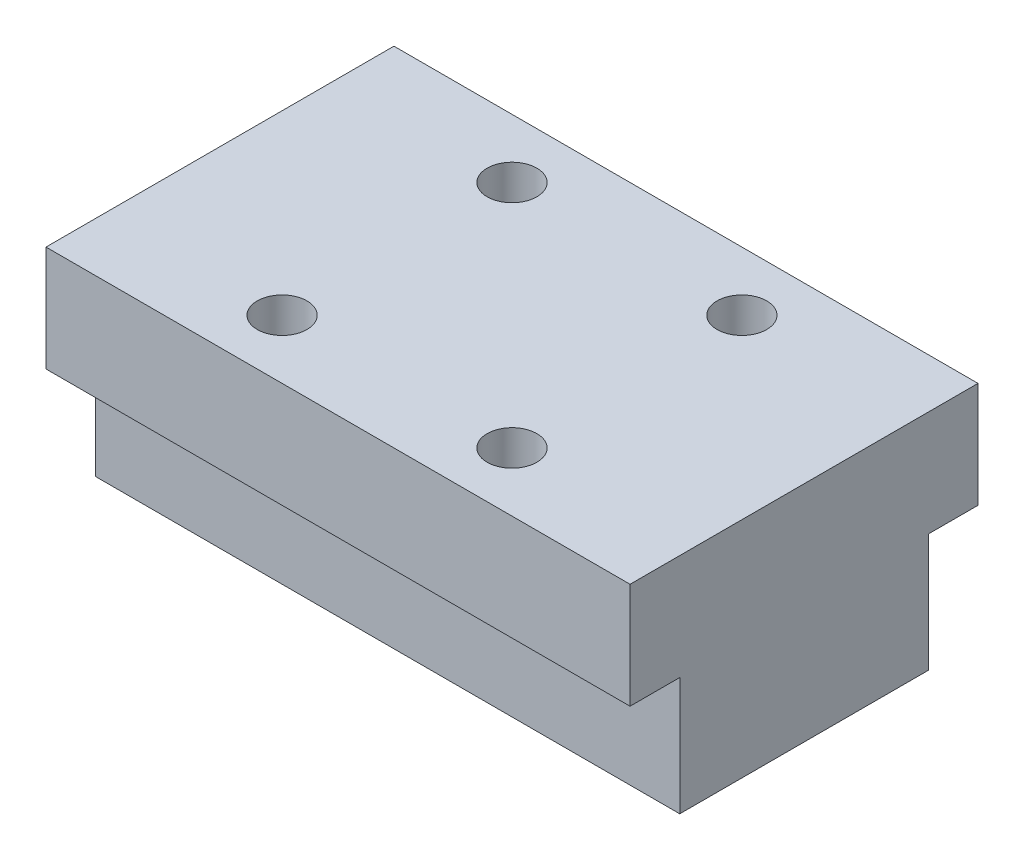
ISO-10303-21;
HEADER;
FILE_DESCRIPTION(('STEP AP214'),'2;1');
FILE_NAME('part.step','',(''),(''),'','','');
FILE_SCHEMA(('AUTOMOTIVE_DESIGN { 1 0 10303 214 1 1 1 1 }'));
ENDSEC;
DATA;
#1=APPLICATION_CONTEXT('core data for automotive mechanical design processes');
#2=APPLICATION_PROTOCOL_DEFINITION('international standard','automotive_design',2000,#1);
#3=PRODUCT_CONTEXT('',#1,'mechanical');
#4=PRODUCT('Part','Part','',(#3));
#5=PRODUCT_RELATED_PRODUCT_CATEGORY('part','',(#4));
#6=PRODUCT_DEFINITION_FORMATION('','',#4);
#7=PRODUCT_DEFINITION_CONTEXT('part definition',#1,'design');
#8=PRODUCT_DEFINITION('design','',#6,#7);
#9=PRODUCT_DEFINITION_SHAPE('','',#8);
#10=(LENGTH_UNIT() NAMED_UNIT(*) SI_UNIT(.MILLI.,.METRE.));
#11=(NAMED_UNIT(*) PLANE_ANGLE_UNIT() SI_UNIT($,.RADIAN.));
#12=(NAMED_UNIT(*) SI_UNIT($,.STERADIAN.) SOLID_ANGLE_UNIT());
#13=UNCERTAINTY_MEASURE_WITH_UNIT(LENGTH_MEASURE(1.E-05),#10,'distance_accuracy_value','');
#14=(GEOMETRIC_REPRESENTATION_CONTEXT(3) GLOBAL_UNCERTAINTY_ASSIGNED_CONTEXT((#13)) GLOBAL_UNIT_ASSIGNED_CONTEXT((#10,
#11,#12)) REPRESENTATION_CONTEXT('',''));
#15=CARTESIAN_POINT('',(0.,0.,0.));
#16=DIRECTION('',(0.,0.,1.));
#17=DIRECTION('',(1.,0.,0.));
#18=AXIS2_PLACEMENT_3D('',#15,#16,#17);
#19=CARTESIAN_POINT('',(47.,-4.75,-10.));
#20=DIRECTION('',(0.,0.,1.));
#21=DIRECTION('',(1.,0.,0.));
#22=AXIS2_PLACEMENT_3D('',#19,#20,#21);
#23=PLANE('',#22);
#24=DIRECTION('',(0.,1.,0.));
#25=VECTOR('',#24,1.);
#26=CARTESIAN_POINT('',(0.,-4.75,-10.));
#27=LINE('',#26,#25);
#28=CARTESIAN_POINT('',(0.,-4.75,-10.));
#29=VERTEX_POINT('',#28);
#30=CARTESIAN_POINT('',(0.,4.75,-10.));
#31=VERTEX_POINT('',#30);
#32=EDGE_CURVE('E198',#29,#31,#27,.T.);
#33=ORIENTED_EDGE('',*,*,#32,.T.);
#34=DIRECTION('',(-1.,0.,0.));
#35=VECTOR('',#34,1.);
#36=CARTESIAN_POINT('',(47.,4.75,-10.));
#37=LINE('',#36,#35);
#38=CARTESIAN_POINT('',(12.3959503782261,4.75,-10.));
#39=VERTEX_POINT('',#38);
#40=EDGE_CURVE('E165',#39,#31,#37,.T.);
#41=ORIENTED_EDGE('',*,*,#40,.F.);
#42=CARTESIAN_POINT('',(16.1040496217739,4.75,-10.));
#43=VERTEX_POINT('',#42);
#44=EDGE_CURVE('E180',#43,#39,#37,.T.);
#45=ORIENTED_EDGE('',*,*,#44,.F.);
#46=CARTESIAN_POINT('',(30.8959503782261,4.75,-10.));
#47=VERTEX_POINT('',#46);
#48=EDGE_CURVE('E178',#47,#43,#37,.T.);
#49=ORIENTED_EDGE('',*,*,#48,.F.);
#50=CARTESIAN_POINT('',(34.6040496217739,4.75,-10.));
#51=VERTEX_POINT('',#50);
#52=EDGE_CURVE('E172',#51,#47,#37,.T.);
#53=ORIENTED_EDGE('',*,*,#52,.F.);
#54=CARTESIAN_POINT('',(47.,4.75,-10.));
#55=VERTEX_POINT('',#54);
#56=EDGE_CURVE('E53',#55,#51,#37,.T.);
#57=ORIENTED_EDGE('',*,*,#56,.F.);
#58=DIRECTION('',(0.,1.,0.));
#59=VECTOR('',#58,1.);
#60=CARTESIAN_POINT('',(47.,-4.75,-10.));
#61=LINE('',#60,#59);
#62=CARTESIAN_POINT('',(47.,-4.75,-10.));
#63=VERTEX_POINT('',#62);
#64=EDGE_CURVE('E242',#63,#55,#61,.T.);
#65=ORIENTED_EDGE('',*,*,#64,.F.);
#66=DIRECTION('',(-1.,0.,0.));
#67=VECTOR('',#66,1.);
#68=CARTESIAN_POINT('',(47.,-4.75,-10.));
#69=LINE('',#68,#67);
#70=EDGE_CURVE('E202',#63,#29,#69,.T.);
#71=ORIENTED_EDGE('',*,*,#70,.T.);
#72=EDGE_LOOP('',(#33,#41,#45,#49,#53,#57,#65,#71));
#73=FACE_BOUND('',#72,.T.);
#74=ADVANCED_FACE('F45',(#73),#23,.F.);
#75=CARTESIAN_POINT('',(47.,-4.75,10.));
#76=DIRECTION('',(0.,0.,-1.));
#77=DIRECTION('',(-1.,0.,0.));
#78=AXIS2_PLACEMENT_3D('',#75,#76,#77);
#79=PLANE('',#78);
#80=DIRECTION('',(0.,-1.,0.));
#81=VECTOR('',#80,1.);
#82=CARTESIAN_POINT('',(0.,-4.75,10.));
#83=LINE('',#82,#81);
#84=CARTESIAN_POINT('',(0.,4.75,10.));
#85=VERTEX_POINT('',#84);
#86=CARTESIAN_POINT('',(0.,-4.75,10.));
#87=VERTEX_POINT('',#86);
#88=EDGE_CURVE('E206',#85,#87,#83,.T.);
#89=ORIENTED_EDGE('',*,*,#88,.T.);
#90=DIRECTION('',(-1.,0.,0.));
#91=VECTOR('',#90,1.);
#92=CARTESIAN_POINT('',(47.,-4.75,10.));
#93=LINE('',#92,#91);
#94=CARTESIAN_POINT('',(47.,-4.75,10.));
#95=VERTEX_POINT('',#94);
#96=EDGE_CURVE('E168',#95,#87,#93,.T.);
#97=ORIENTED_EDGE('',*,*,#96,.F.);
#98=DIRECTION('',(0.,-1.,0.));
#99=VECTOR('',#98,1.);
#100=CARTESIAN_POINT('',(47.,-4.75,10.));
#101=LINE('',#100,#99);
#102=CARTESIAN_POINT('',(47.,4.75,10.));
#103=VERTEX_POINT('',#102);
#104=EDGE_CURVE('E245',#103,#95,#101,.T.);
#105=ORIENTED_EDGE('',*,*,#104,.F.);
#106=DIRECTION('',(-1.,0.,0.));
#107=VECTOR('',#106,1.);
#108=CARTESIAN_POINT('',(47.,4.75,10.));
#109=LINE('',#108,#107);
#110=CARTESIAN_POINT('',(34.6040496217739,4.75,10.));
#111=VERTEX_POINT('',#110);
#112=EDGE_CURVE('E162',#103,#111,#109,.T.);
#113=ORIENTED_EDGE('',*,*,#112,.T.);
#114=CARTESIAN_POINT('',(30.8959503782261,4.75,10.));
#115=VERTEX_POINT('',#114);
#116=EDGE_CURVE('E144',#111,#115,#109,.T.);
#117=ORIENTED_EDGE('',*,*,#116,.T.);
#118=CARTESIAN_POINT('',(16.1040496217739,4.75,10.));
#119=VERTEX_POINT('',#118);
#120=EDGE_CURVE('E151',#115,#119,#109,.T.);
#121=ORIENTED_EDGE('',*,*,#120,.T.);
#122=CARTESIAN_POINT('',(12.3959503782261,4.75,10.));
#123=VERTEX_POINT('',#122);
#124=EDGE_CURVE('E159',#119,#123,#109,.T.);
#125=ORIENTED_EDGE('',*,*,#124,.T.);
#126=EDGE_CURVE('E166',#123,#85,#109,.T.);
#127=ORIENTED_EDGE('',*,*,#126,.T.);
#128=EDGE_LOOP('',(#89,#97,#105,#113,#117,#121,#125,#127));
#129=FACE_BOUND('',#128,.T.);
#130=ADVANCED_FACE('F161',(#129),#79,.F.);
#131=CARTESIAN_POINT('',(47.,-4.75,10.));
#132=DIRECTION('',(0.,1.,0.));
#133=DIRECTION('',(0.,0.,1.));
#134=AXIS2_PLACEMENT_3D('',#131,#132,#133);
#135=PLANE('',#134);
#136=DIRECTION('',(0.,0.,-1.));
#137=VECTOR('',#136,1.);
#138=CARTESIAN_POINT('',(0.,-4.75,10.));
#139=LINE('',#138,#137);
#140=EDGE_CURVE('E246',#87,#29,#139,.T.);
#141=ORIENTED_EDGE('',*,*,#140,.T.);
#142=ORIENTED_EDGE('',*,*,#70,.F.);
#143=DIRECTION('',(0.,0.,-1.));
#144=VECTOR('',#143,1.);
#145=CARTESIAN_POINT('',(47.,-4.75,10.));
#146=LINE('',#145,#144);
#147=EDGE_CURVE('E249',#95,#63,#146,.T.);
#148=ORIENTED_EDGE('',*,*,#147,.F.);
#149=ORIENTED_EDGE('',*,*,#96,.T.);
#150=EDGE_LOOP('',(#141,#142,#148,#149));
#151=FACE_BOUND('',#150,.T.);
#152=ADVANCED_FACE('F317',(#151),#135,.F.);
#153=CARTESIAN_POINT('',(47.,0.,0.));
#154=DIRECTION('',(-1.,0.,0.));
#155=DIRECTION('',(0.,0.,1.));
#156=AXIS2_PLACEMENT_3D('',#153,#154,#155);
#157=PLANE('',#156);
#158=ORIENTED_EDGE('',*,*,#64,.T.);
#159=DIRECTION('',(0.,0.,-1.));
#160=VECTOR('',#159,1.);
#161=CARTESIAN_POINT('',(47.,4.75,0.));
#162=LINE('',#161,#160);
#163=CARTESIAN_POINT('',(47.,4.75,-14.));
#164=VERTEX_POINT('',#163);
#165=EDGE_CURVE('E295',#55,#164,#162,.T.);
#166=ORIENTED_EDGE('',*,*,#165,.T.);
#167=DIRECTION('',(0.,-1.,0.));
#168=VECTOR('',#167,1.);
#169=CARTESIAN_POINT('',(47.,13.25,-14.));
#170=LINE('',#169,#168);
#171=CARTESIAN_POINT('',(47.,13.25,-14.));
#172=VERTEX_POINT('',#171);
#173=EDGE_CURVE('E207',#172,#164,#170,.T.);
#174=ORIENTED_EDGE('',*,*,#173,.F.);
#175=DIRECTION('',(0.,0.,-1.));
#176=VECTOR('',#175,1.);
#177=CARTESIAN_POINT('',(47.,13.25,0.));
#178=LINE('',#177,#176);
#179=CARTESIAN_POINT('',(47.,13.25,14.));
#180=VERTEX_POINT('',#179);
#181=EDGE_CURVE('E222',#180,#172,#178,.T.);
#182=ORIENTED_EDGE('',*,*,#181,.F.);
#183=DIRECTION('',(0.,-1.,0.));
#184=VECTOR('',#183,1.);
#185=CARTESIAN_POINT('',(47.,13.25,14.));
#186=LINE('',#185,#184);
#187=CARTESIAN_POINT('',(47.,4.75,14.));
#188=VERTEX_POINT('',#187);
#189=EDGE_CURVE('E228',#180,#188,#186,.T.);
#190=ORIENTED_EDGE('',*,*,#189,.T.);
#191=EDGE_CURVE('E292',#188,#103,#162,.T.);
#192=ORIENTED_EDGE('',*,*,#191,.T.);
#193=ORIENTED_EDGE('',*,*,#104,.T.);
#194=ORIENTED_EDGE('',*,*,#147,.T.);
#195=EDGE_LOOP('',(#158,#166,#174,#182,#190,#192,#193,#194));
#196=FACE_BOUND('',#195,.T.);
#197=ADVANCED_FACE('F315',(#196),#157,.F.);
#198=CARTESIAN_POINT('',(0.,0.,0.));
#199=DIRECTION('',(-1.,0.,0.));
#200=DIRECTION('',(0.,0.,1.));
#201=AXIS2_PLACEMENT_3D('',#198,#199,#200);
#202=PLANE('',#201);
#203=ORIENTED_EDGE('',*,*,#32,.F.);
#204=ORIENTED_EDGE('',*,*,#140,.F.);
#205=ORIENTED_EDGE('',*,*,#88,.F.);
#206=DIRECTION('',(0.,0.,1.));
#207=VECTOR('',#206,1.);
#208=CARTESIAN_POINT('',(0.,4.75,0.));
#209=LINE('',#208,#207);
#210=CARTESIAN_POINT('',(0.,4.75,14.));
#211=VERTEX_POINT('',#210);
#212=EDGE_CURVE('E218',#85,#211,#209,.T.);
#213=ORIENTED_EDGE('',*,*,#212,.T.);
#214=DIRECTION('',(0.,-1.,0.));
#215=VECTOR('',#214,1.);
#216=CARTESIAN_POINT('',(0.,13.25,14.));
#217=LINE('',#216,#215);
#218=CARTESIAN_POINT('',(0.,13.25,14.));
#219=VERTEX_POINT('',#218);
#220=EDGE_CURVE('E232',#219,#211,#217,.T.);
#221=ORIENTED_EDGE('',*,*,#220,.F.);
#222=DIRECTION('',(0.,0.,1.));
#223=VECTOR('',#222,1.);
#224=CARTESIAN_POINT('',(0.,13.25,0.));
#225=LINE('',#224,#223);
#226=CARTESIAN_POINT('',(0.,13.25,-14.));
#227=VERTEX_POINT('',#226);
#228=EDGE_CURVE('E286',#227,#219,#225,.T.);
#229=ORIENTED_EDGE('',*,*,#228,.F.);
#230=DIRECTION('',(0.,-1.,0.));
#231=VECTOR('',#230,1.);
#232=CARTESIAN_POINT('',(0.,13.25,-14.));
#233=LINE('',#232,#231);
#234=CARTESIAN_POINT('',(0.,4.75,-14.));
#235=VERTEX_POINT('',#234);
#236=EDGE_CURVE('E214',#227,#235,#233,.T.);
#237=ORIENTED_EDGE('',*,*,#236,.T.);
#238=EDGE_CURVE('E210',#235,#31,#209,.T.);
#239=ORIENTED_EDGE('',*,*,#238,.T.);
#240=EDGE_LOOP('',(#203,#204,#205,#213,#221,#229,#237,#239));
#241=FACE_BOUND('',#240,.T.);
#242=ADVANCED_FACE('F211',(#241),#202,.T.);
#243=CARTESIAN_POINT('',(0.,4.75,0.));
#244=DIRECTION('',(0.,1.,0.));
#245=DIRECTION('',(0.,0.,1.));
#246=AXIS2_PLACEMENT_3D('',#243,#244,#245);
#247=PLANE('',#246);
#248=ORIENTED_EDGE('',*,*,#56,.T.);
#249=CARTESIAN_POINT('',(32.75,4.75,-9.24999999999998));
#250=DIRECTION('',(0.,1.,0.));
#251=DIRECTION('',(0.,0.,-1.));
#252=AXIS2_PLACEMENT_3D('',#249,#250,#251);
#253=CIRCLE('',#252,2.);
#254=EDGE_CURVE('E193',#51,#47,#253,.T.);
#255=ORIENTED_EDGE('',*,*,#254,.T.);
#256=ORIENTED_EDGE('',*,*,#48,.T.);
#257=CARTESIAN_POINT('',(14.25,4.75,-9.25));
#258=DIRECTION('',(0.,1.,0.));
#259=DIRECTION('',(0.,0.,1.));
#260=AXIS2_PLACEMENT_3D('',#257,#258,#259);
#261=CIRCLE('',#260,2.);
#262=EDGE_CURVE('E192',#43,#39,#261,.T.);
#263=ORIENTED_EDGE('',*,*,#262,.T.);
#264=ORIENTED_EDGE('',*,*,#40,.T.);
#265=ORIENTED_EDGE('',*,*,#238,.F.);
#266=DIRECTION('',(-1.,0.,0.));
#267=VECTOR('',#266,1.);
#268=CARTESIAN_POINT('',(0.,4.75,-14.));
#269=LINE('',#268,#267);
#270=EDGE_CURVE('E224',#164,#235,#269,.T.);
#271=ORIENTED_EDGE('',*,*,#270,.F.);
#272=ORIENTED_EDGE('',*,*,#165,.F.);
#273=EDGE_LOOP('',(#248,#255,#256,#263,#264,#265,#271,#272));
#274=FACE_BOUND('',#273,.T.);
#275=ADVANCED_FACE('F191',(#274),#247,.F.);
#276=CARTESIAN_POINT('',(0.,13.25,-14.));
#277=DIRECTION('',(0.,0.,1.));
#278=DIRECTION('',(1.,0.,0.));
#279=AXIS2_PLACEMENT_3D('',#276,#277,#278);
#280=PLANE('',#279);
#281=ORIENTED_EDGE('',*,*,#270,.T.);
#282=ORIENTED_EDGE('',*,*,#236,.F.);
#283=DIRECTION('',(-1.,0.,0.));
#284=VECTOR('',#283,1.);
#285=CARTESIAN_POINT('',(0.,13.25,-14.));
#286=LINE('',#285,#284);
#287=EDGE_CURVE('E289',#172,#227,#286,.T.);
#288=ORIENTED_EDGE('',*,*,#287,.F.);
#289=ORIENTED_EDGE('',*,*,#173,.T.);
#290=EDGE_LOOP('',(#281,#282,#288,#289));
#291=FACE_BOUND('',#290,.T.);
#292=ADVANCED_FACE('F314',(#291),#280,.F.);
#293=CARTESIAN_POINT('',(0.,13.25,14.));
#294=DIRECTION('',(0.,0.,-1.));
#295=DIRECTION('',(-1.,0.,0.));
#296=AXIS2_PLACEMENT_3D('',#293,#294,#295);
#297=PLANE('',#296);
#298=DIRECTION('',(1.,0.,0.));
#299=VECTOR('',#298,1.);
#300=CARTESIAN_POINT('',(0.,4.75,14.));
#301=LINE('',#300,#299);
#302=EDGE_CURVE('E217',#211,#188,#301,.T.);
#303=ORIENTED_EDGE('',*,*,#302,.T.);
#304=ORIENTED_EDGE('',*,*,#189,.F.);
#305=DIRECTION('',(1.,0.,0.));
#306=VECTOR('',#305,1.);
#307=CARTESIAN_POINT('',(0.,13.25,14.));
#308=LINE('',#307,#306);
#309=EDGE_CURVE('E233',#219,#180,#308,.T.);
#310=ORIENTED_EDGE('',*,*,#309,.F.);
#311=ORIENTED_EDGE('',*,*,#220,.T.);
#312=EDGE_LOOP('',(#303,#304,#310,#311));
#313=FACE_BOUND('',#312,.T.);
#314=ADVANCED_FACE('F280',(#313),#297,.F.);
#315=CARTESIAN_POINT('',(0.,13.25,0.));
#316=DIRECTION('',(0.,1.,0.));
#317=DIRECTION('',(0.,0.,1.));
#318=AXIS2_PLACEMENT_3D('',#315,#316,#317);
#319=PLANE('',#318);
#320=CARTESIAN_POINT('',(14.25,13.25,9.25));
#321=DIRECTION('',(0.,1.,0.));
#322=DIRECTION('',(0.,0.,-1.));
#323=AXIS2_PLACEMENT_3D('',#320,#321,#322);
#324=CIRCLE('',#323,2.);
#325=CARTESIAN_POINT('',(14.25,13.25,7.25));
#326=VERTEX_POINT('',#325);
#327=EDGE_CURVE('E147',#326,#326,#324,.T.);
#328=ORIENTED_EDGE('',*,*,#327,.F.);
#329=EDGE_LOOP('',(#328));
#330=FACE_BOUND('',#329,.T.);
#331=CARTESIAN_POINT('',(32.75,13.25,9.24999999999998));
#332=DIRECTION('',(0.,1.,0.));
#333=DIRECTION('',(0.,0.,1.));
#334=AXIS2_PLACEMENT_3D('',#331,#332,#333);
#335=CIRCLE('',#334,2.);
#336=CARTESIAN_POINT('',(32.75,13.25,11.25));
#337=VERTEX_POINT('',#336);
#338=EDGE_CURVE('E146',#337,#337,#335,.T.);
#339=ORIENTED_EDGE('',*,*,#338,.F.);
#340=EDGE_LOOP('',(#339));
#341=FACE_BOUND('',#340,.T.);
#342=CARTESIAN_POINT('',(32.75,13.25,-9.24999999999998));
#343=DIRECTION('',(0.,1.,0.));
#344=DIRECTION('',(0.,0.,-1.));
#345=AXIS2_PLACEMENT_3D('',#342,#343,#344);
#346=CIRCLE('',#345,2.);
#347=CARTESIAN_POINT('',(32.75,13.25,-11.25));
#348=VERTEX_POINT('',#347);
#349=EDGE_CURVE('E309',#348,#348,#346,.T.);
#350=ORIENTED_EDGE('',*,*,#349,.F.);
#351=EDGE_LOOP('',(#350));
#352=FACE_BOUND('',#351,.T.);
#353=CARTESIAN_POINT('',(14.25,13.25,-9.25));
#354=DIRECTION('',(0.,1.,0.));
#355=DIRECTION('',(0.,0.,1.));
#356=AXIS2_PLACEMENT_3D('',#353,#354,#355);
#357=CIRCLE('',#356,2.);
#358=CARTESIAN_POINT('',(14.25,13.25,-7.25));
#359=VERTEX_POINT('',#358);
#360=EDGE_CURVE('E303',#359,#359,#357,.T.);
#361=ORIENTED_EDGE('',*,*,#360,.F.);
#362=EDGE_LOOP('',(#361));
#363=FACE_BOUND('',#362,.T.);
#364=ORIENTED_EDGE('',*,*,#181,.T.);
#365=ORIENTED_EDGE('',*,*,#287,.T.);
#366=ORIENTED_EDGE('',*,*,#228,.T.);
#367=ORIENTED_EDGE('',*,*,#309,.T.);
#368=EDGE_LOOP('',(#364,#365,#366,#367));
#369=FACE_BOUND('',#368,.T.);
#370=ADVANCED_FACE('F312',(#330,#341,#352,#363,#369),#319,.T.);
#371=ORIENTED_EDGE('',*,*,#126,.F.);
#372=CARTESIAN_POINT('',(14.25,4.75,9.25));
#373=DIRECTION('',(0.,1.,0.));
#374=DIRECTION('',(0.,0.,-1.));
#375=AXIS2_PLACEMENT_3D('',#372,#373,#374);
#376=CIRCLE('',#375,2.);
#377=EDGE_CURVE('E155',#123,#119,#376,.T.);
#378=ORIENTED_EDGE('',*,*,#377,.T.);
#379=ORIENTED_EDGE('',*,*,#120,.F.);
#380=CARTESIAN_POINT('',(32.75,4.75,9.24999999999998));
#381=DIRECTION('',(0.,1.,0.));
#382=DIRECTION('',(0.,0.,1.));
#383=AXIS2_PLACEMENT_3D('',#380,#381,#382);
#384=CIRCLE('',#383,2.);
#385=EDGE_CURVE('E11',#115,#111,#384,.T.);
#386=ORIENTED_EDGE('',*,*,#385,.T.);
#387=ORIENTED_EDGE('',*,*,#112,.F.);
#388=ORIENTED_EDGE('',*,*,#191,.F.);
#389=ORIENTED_EDGE('',*,*,#302,.F.);
#390=ORIENTED_EDGE('',*,*,#212,.F.);
#391=EDGE_LOOP('',(#371,#378,#379,#386,#387,#388,#389,#390));
#392=FACE_BOUND('',#391,.T.);
#393=ADVANCED_FACE('F153',(#392),#247,.F.);
#394=CARTESIAN_POINT('',(32.75,4.75,9.24999999999998));
#395=DIRECTION('',(0.,1.,0.));
#396=DIRECTION('',(0.,0.,1.));
#397=AXIS2_PLACEMENT_3D('',#394,#395,#396);
#398=PLANE('',#397);
#399=ORIENTED_EDGE('',*,*,#116,.F.);
#400=CARTESIAN_POINT('',(32.75,4.75,9.24999999999998));
#401=DIRECTION('',(0.,1.,0.));
#402=DIRECTION('',(0.,0.,1.));
#403=AXIS2_PLACEMENT_3D('',#400,#401,#402);
#404=CIRCLE('',#403,2.);
#405=EDGE_CURVE('E135',#111,#115,#404,.T.);
#406=ORIENTED_EDGE('',*,*,#405,.T.);
#407=EDGE_LOOP('',(#399,#406));
#408=FACE_BOUND('',#407,.T.);
#409=ADVANCED_FACE('F142',(#408),#398,.T.);
#410=CARTESIAN_POINT('',(32.75,4.75,9.24999999999998));
#411=DIRECTION('',(0.,1.,0.));
#412=DIRECTION('',(0.,0.,1.));
#413=AXIS2_PLACEMENT_3D('',#410,#411,#412);
#414=CYLINDRICAL_SURFACE('',#413,2.);
#415=ORIENTED_EDGE('',*,*,#405,.F.);
#416=ORIENTED_EDGE('',*,*,#385,.F.);
#417=EDGE_LOOP('',(#415,#416));
#418=FACE_BOUND('',#417,.T.);
#419=ORIENTED_EDGE('',*,*,#338,.T.);
#420=EDGE_LOOP('',(#419));
#421=FACE_BOUND('',#420,.T.);
#422=ADVANCED_FACE('F133',(#418,#421),#414,.F.);
#423=CARTESIAN_POINT('',(14.25,4.75,9.25));
#424=DIRECTION('',(0.,-1.,0.));
#425=DIRECTION('',(0.,0.,-1.));
#426=AXIS2_PLACEMENT_3D('',#423,#424,#425);
#427=PLANE('',#426);
#428=EDGE_CURVE('E267',#119,#123,#376,.T.);
#429=ORIENTED_EDGE('',*,*,#428,.T.);
#430=ORIENTED_EDGE('',*,*,#124,.F.);
#431=EDGE_LOOP('',(#429,#430));
#432=FACE_BOUND('',#431,.T.);
#433=ADVANCED_FACE('F266',(#432),#427,.F.);
#434=CARTESIAN_POINT('',(14.25,4.75,9.25));
#435=DIRECTION('',(0.,1.,0.));
#436=DIRECTION('',(0.,0.,1.));
#437=AXIS2_PLACEMENT_3D('',#434,#435,#436);
#438=CYLINDRICAL_SURFACE('',#437,2.);
#439=ORIENTED_EDGE('',*,*,#377,.F.);
#440=ORIENTED_EDGE('',*,*,#428,.F.);
#441=EDGE_LOOP('',(#439,#440));
#442=FACE_BOUND('',#441,.T.);
#443=ORIENTED_EDGE('',*,*,#327,.T.);
#444=EDGE_LOOP('',(#443));
#445=FACE_BOUND('',#444,.T.);
#446=ADVANCED_FACE('F271',(#442,#445),#438,.F.);
#447=CARTESIAN_POINT('',(14.25,4.75,-9.25));
#448=DIRECTION('',(0.,1.,0.));
#449=DIRECTION('',(0.,0.,1.));
#450=AXIS2_PLACEMENT_3D('',#447,#448,#449);
#451=PLANE('',#450);
#452=ORIENTED_EDGE('',*,*,#44,.T.);
#453=EDGE_CURVE('E59',#39,#43,#261,.T.);
#454=ORIENTED_EDGE('',*,*,#453,.T.);
#455=EDGE_LOOP('',(#452,#454));
#456=FACE_BOUND('',#455,.T.);
#457=ADVANCED_FACE('F450',(#456),#451,.T.);
#458=CARTESIAN_POINT('',(14.25,4.75,-9.25));
#459=DIRECTION('',(0.,1.,0.));
#460=DIRECTION('',(0.,0.,1.));
#461=AXIS2_PLACEMENT_3D('',#458,#459,#460);
#462=CYLINDRICAL_SURFACE('',#461,2.);
#463=ORIENTED_EDGE('',*,*,#262,.F.);
#464=ORIENTED_EDGE('',*,*,#453,.F.);
#465=EDGE_LOOP('',(#463,#464));
#466=FACE_BOUND('',#465,.T.);
#467=ORIENTED_EDGE('',*,*,#360,.T.);
#468=EDGE_LOOP('',(#467));
#469=FACE_BOUND('',#468,.T.);
#470=ADVANCED_FACE('F459',(#466,#469),#462,.F.);
#471=CARTESIAN_POINT('',(32.75,4.75,-9.24999999999998));
#472=DIRECTION('',(0.,-1.,0.));
#473=DIRECTION('',(0.,0.,-1.));
#474=AXIS2_PLACEMENT_3D('',#471,#472,#473);
#475=PLANE('',#474);
#476=EDGE_CURVE('E66',#47,#51,#253,.T.);
#477=ORIENTED_EDGE('',*,*,#476,.T.);
#478=ORIENTED_EDGE('',*,*,#52,.T.);
#479=EDGE_LOOP('',(#477,#478));
#480=FACE_BOUND('',#479,.T.);
#481=ADVANCED_FACE('F468',(#480),#475,.F.);
#482=CARTESIAN_POINT('',(32.75,4.75,-9.24999999999998));
#483=DIRECTION('',(0.,1.,0.));
#484=DIRECTION('',(0.,0.,1.));
#485=AXIS2_PLACEMENT_3D('',#482,#483,#484);
#486=CYLINDRICAL_SURFACE('',#485,2.);
#487=ORIENTED_EDGE('',*,*,#476,.F.);
#488=ORIENTED_EDGE('',*,*,#254,.F.);
#489=EDGE_LOOP('',(#487,#488));
#490=FACE_BOUND('',#489,.T.);
#491=ORIENTED_EDGE('',*,*,#349,.T.);
#492=EDGE_LOOP('',(#491));
#493=FACE_BOUND('',#492,.T.);
#494=ADVANCED_FACE('F477',(#490,#493),#486,.F.);
#495=CLOSED_SHELL('',(#74,#130,#152,#197,#242,#275,#292,#314,#370,#393,#409,#422,#433,#446,#457,
#470,#481,#494));
#496=MANIFOLD_SOLID_BREP('B2',#495);
#497=ADVANCED_BREP_SHAPE_REPRESENTATION('',(#18,#496),#14);
#498=SHAPE_DEFINITION_REPRESENTATION(#9,#497);
ENDSEC;
END-ISO-10303-21;
